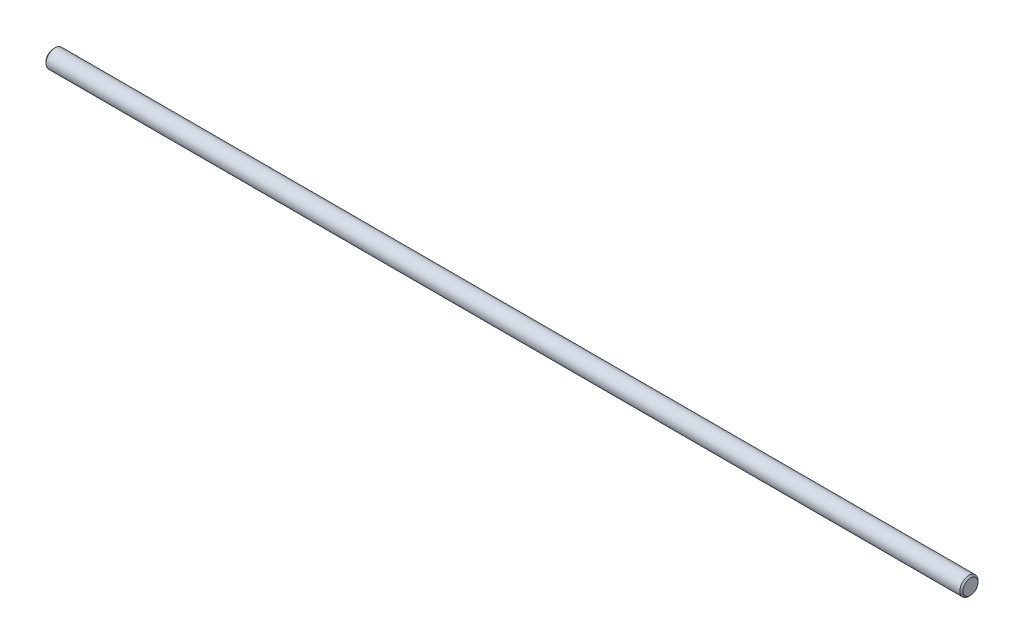
ISO-10303-21;
HEADER;
FILE_DESCRIPTION(('STEP AP214'),'2;1');
FILE_NAME('part.step','',(''),(''),'','','');
FILE_SCHEMA(('AUTOMOTIVE_DESIGN { 1 0 10303 214 1 1 1 1 }'));
ENDSEC;
DATA;
#1=APPLICATION_CONTEXT('core data for automotive mechanical design processes');
#2=APPLICATION_PROTOCOL_DEFINITION('international standard','automotive_design',2000,#1);
#3=PRODUCT_CONTEXT('',#1,'mechanical');
#4=PRODUCT('Part','Part','',(#3));
#5=PRODUCT_RELATED_PRODUCT_CATEGORY('part','',(#4));
#6=PRODUCT_DEFINITION_FORMATION('','',#4);
#7=PRODUCT_DEFINITION_CONTEXT('part definition',#1,'design');
#8=PRODUCT_DEFINITION('design','',#6,#7);
#9=PRODUCT_DEFINITION_SHAPE('','',#8);
#10=(LENGTH_UNIT() NAMED_UNIT(*) SI_UNIT(.MILLI.,.METRE.));
#11=(NAMED_UNIT(*) PLANE_ANGLE_UNIT() SI_UNIT($,.RADIAN.));
#12=(NAMED_UNIT(*) SI_UNIT($,.STERADIAN.) SOLID_ANGLE_UNIT());
#13=UNCERTAINTY_MEASURE_WITH_UNIT(LENGTH_MEASURE(1.E-05),#10,'distance_accuracy_value','');
#14=(GEOMETRIC_REPRESENTATION_CONTEXT(3) GLOBAL_UNCERTAINTY_ASSIGNED_CONTEXT((#13)) GLOBAL_UNIT_ASSIGNED_CONTEXT((#10,
#11,#12)) REPRESENTATION_CONTEXT('',''));
#15=CARTESIAN_POINT('',(0.,0.,0.));
#16=DIRECTION('',(0.,0.,1.));
#17=DIRECTION('',(1.,0.,0.));
#18=AXIS2_PLACEMENT_3D('',#15,#16,#17);
#19=CARTESIAN_POINT('',(116.415189936237,-49.3051174113286,-169.304665931118));
#20=DIRECTION('',(-1.,0.,0.));
#21=DIRECTION('',(0.,0.822986585231241,-0.568060807070353));
#22=AXIS2_PLACEMENT_3D('',#19,#20,#21);
#23=PLANE('',#22);
#24=CARTESIAN_POINT('',(116.415189936237,-27.5000014400765,-158.838677326107));
#25=DIRECTION('',(-1.,0.,0.));
#26=DIRECTION('',(0.,0.,1.));
#27=AXIS2_PLACEMENT_3D('',#24,#25,#26);
#28=CIRCLE('',#27,2.50000000000014);
#29=CARTESIAN_POINT('',(116.415189936237,-27.5000014400765,-156.338677326106));
#30=VERTEX_POINT('',#29);
#31=EDGE_CURVE('E10',#30,#30,#28,.T.);
#32=ORIENTED_EDGE('',*,*,#31,.T.);
#33=EDGE_LOOP('',(#32));
#34=FACE_BOUND('',#33,.T.);
#35=ADVANCED_FACE('F31',(#34),#23,.T.);
#36=CARTESIAN_POINT('',(419.91518932427,-27.5000014400765,-158.838677326107));
#37=DIRECTION('',(1.,0.,0.));
#38=DIRECTION('',(0.,0.,-1.));
#39=AXIS2_PLACEMENT_3D('',#36,#37,#38);
#40=PLANE('',#39);
#41=CARTESIAN_POINT('',(419.91518932427,-27.5000014400765,-158.838677326107));
#42=DIRECTION('',(1.,0.,0.));
#43=DIRECTION('',(0.,0.,-1.));
#44=AXIS2_PLACEMENT_3D('',#41,#42,#43);
#45=CIRCLE('',#44,2.49999999999992);
#46=CARTESIAN_POINT('',(419.91518932427,-27.5000014400765,-161.338677326106));
#47=VERTEX_POINT('',#46);
#48=EDGE_CURVE('E46',#47,#47,#45,.T.);
#49=ORIENTED_EDGE('',*,*,#48,.T.);
#50=EDGE_LOOP('',(#49));
#51=FACE_BOUND('',#50,.T.);
#52=ADVANCED_FACE('F52',(#51),#40,.T.);
#53=CARTESIAN_POINT('',(107.929908561998,-27.5000014400765,-158.838677326107));
#54=DIRECTION('',(1.,0.,0.));
#55=DIRECTION('',(0.,0.,-1.));
#56=AXIS2_PLACEMENT_3D('',#53,#54,#55);
#57=CYLINDRICAL_SURFACE('',#56,3.00000000000002);
#58=CARTESIAN_POINT('',(419.41518932427,-27.5000014400765,-158.838677326107));
#59=DIRECTION('',(1.,0.,0.));
#60=DIRECTION('',(0.,0.,-1.));
#61=AXIS2_PLACEMENT_3D('',#58,#59,#60);
#62=CIRCLE('',#61,3.00000000000002);
#63=CARTESIAN_POINT('',(419.41518932427,-27.5000014400765,-161.838677326107));
#64=VERTEX_POINT('',#63);
#65=EDGE_CURVE('E38',#64,#64,#62,.F.);
#66=ORIENTED_EDGE('',*,*,#65,.T.);
#67=EDGE_LOOP('',(#66));
#68=FACE_BOUND('',#67,.T.);
#69=CARTESIAN_POINT('',(116.915189936237,-27.5000014400765,-158.838677326107));
#70=DIRECTION('',(-1.,0.,0.));
#71=DIRECTION('',(0.,0.,1.));
#72=AXIS2_PLACEMENT_3D('',#69,#70,#71);
#73=CIRCLE('',#72,3.00000000000002);
#74=CARTESIAN_POINT('',(116.915189936237,-27.5000014400765,-155.838677326107));
#75=VERTEX_POINT('',#74);
#76=EDGE_CURVE('E42',#75,#75,#73,.F.);
#77=ORIENTED_EDGE('',*,*,#76,.T.);
#78=EDGE_LOOP('',(#77));
#79=FACE_BOUND('',#78,.T.);
#80=ADVANCED_FACE('F56',(#68,#79),#57,.T.);
#81=CARTESIAN_POINT('',(419.91518932427,-27.5000014400765,-158.838677326107));
#82=DIRECTION('',(-1.,0.,0.));
#83=DIRECTION('',(0.,0.,1.));
#84=AXIS2_PLACEMENT_3D('',#81,#82,#83);
#85=CONICAL_SURFACE('',#84,2.49999999999992,0.785398163397496);
#86=ORIENTED_EDGE('',*,*,#65,.F.);
#87=EDGE_LOOP('',(#86));
#88=FACE_BOUND('',#87,.T.);
#89=ORIENTED_EDGE('',*,*,#48,.F.);
#90=EDGE_LOOP('',(#89));
#91=FACE_BOUND('',#90,.T.);
#92=ADVANCED_FACE('F54',(#88,#91),#85,.T.);
#93=CARTESIAN_POINT('',(116.915189936237,-27.5000014400765,-158.838677326107));
#94=DIRECTION('',(1.,0.,0.));
#95=DIRECTION('',(0.,0.,-1.));
#96=AXIS2_PLACEMENT_3D('',#93,#94,#95);
#97=CONICAL_SURFACE('',#96,3.00000000000002,0.785398163397412);
#98=ORIENTED_EDGE('',*,*,#31,.F.);
#99=EDGE_LOOP('',(#98));
#100=FACE_BOUND('',#99,.T.);
#101=ORIENTED_EDGE('',*,*,#76,.F.);
#102=EDGE_LOOP('',(#101));
#103=FACE_BOUND('',#102,.T.);
#104=ADVANCED_FACE('F33',(#100,#103),#97,.T.);
#105=CLOSED_SHELL('',(#35,#52,#80,#92,#104));
#106=MANIFOLD_SOLID_BREP('B2',#105);
#107=ADVANCED_BREP_SHAPE_REPRESENTATION('',(#18,#106),#14);
#108=SHAPE_DEFINITION_REPRESENTATION(#9,#107);
ENDSEC;
END-ISO-10303-21;
